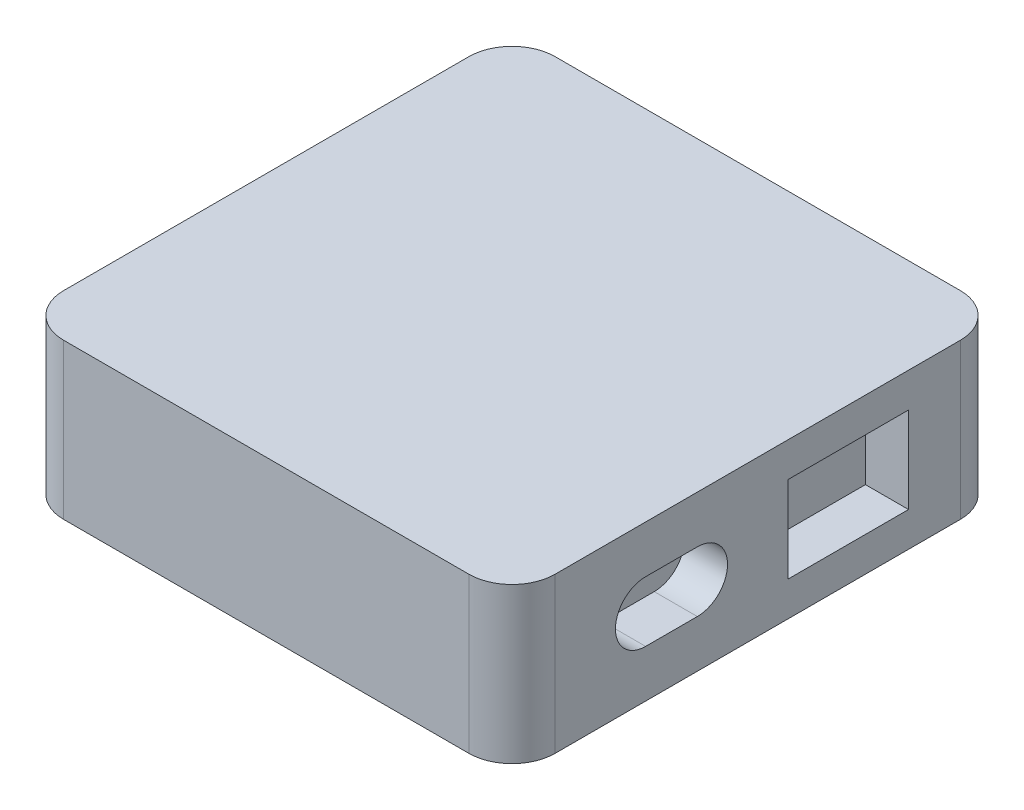
ISO-10303-21;
HEADER;
FILE_DESCRIPTION(('STEP AP214'),'2;1');
FILE_NAME('part.step','',(''),(''),'','','');
FILE_SCHEMA(('AUTOMOTIVE_DESIGN { 1 0 10303 214 1 1 1 1 }'));
ENDSEC;
DATA;
#1=APPLICATION_CONTEXT('core data for automotive mechanical design processes');
#2=APPLICATION_PROTOCOL_DEFINITION('international standard','automotive_design',2000,#1);
#3=PRODUCT_CONTEXT('',#1,'mechanical');
#4=PRODUCT('Part','Part','',(#3));
#5=PRODUCT_RELATED_PRODUCT_CATEGORY('part','',(#4));
#6=PRODUCT_DEFINITION_FORMATION('','',#4);
#7=PRODUCT_DEFINITION_CONTEXT('part definition',#1,'design');
#8=PRODUCT_DEFINITION('design','',#6,#7);
#9=PRODUCT_DEFINITION_SHAPE('','',#8);
#10=(LENGTH_UNIT() NAMED_UNIT(*) SI_UNIT(.MILLI.,.METRE.));
#11=(NAMED_UNIT(*) PLANE_ANGLE_UNIT() SI_UNIT($,.RADIAN.));
#12=(NAMED_UNIT(*) SI_UNIT($,.STERADIAN.) SOLID_ANGLE_UNIT());
#13=UNCERTAINTY_MEASURE_WITH_UNIT(LENGTH_MEASURE(1.E-05),#10,'distance_accuracy_value','');
#14=(GEOMETRIC_REPRESENTATION_CONTEXT(3) GLOBAL_UNCERTAINTY_ASSIGNED_CONTEXT((#13)) GLOBAL_UNIT_ASSIGNED_CONTEXT((#10,
#11,#12)) REPRESENTATION_CONTEXT('',''));
#15=CARTESIAN_POINT('',(0.,0.,0.));
#16=DIRECTION('',(0.,0.,1.));
#17=DIRECTION('',(1.,0.,0.));
#18=AXIS2_PLACEMENT_3D('',#15,#16,#17);
#19=CARTESIAN_POINT('',(-28.5,18.,28.5));
#20=DIRECTION('',(1.,0.,0.));
#21=DIRECTION('',(0.,0.,-1.));
#22=AXIS2_PLACEMENT_3D('',#19,#20,#21);
#23=PLANE('',#22);
#24=DIRECTION('',(0.,0.,1.));
#25=VECTOR('',#24,1.);
#26=CARTESIAN_POINT('',(-28.5,18.,28.5));
#27=LINE('',#26,#25);
#28=CARTESIAN_POINT('',(-28.5,18.,-23.5));
#29=VERTEX_POINT('',#28);
#30=CARTESIAN_POINT('',(-28.5,18.,23.5));
#31=VERTEX_POINT('',#30);
#32=EDGE_CURVE('E252',#29,#31,#27,.T.);
#33=ORIENTED_EDGE('',*,*,#32,.F.);
#34=DIRECTION('',(0.,-1.,0.));
#35=VECTOR('',#34,1.);
#36=CARTESIAN_POINT('',(-28.5,18.,-23.5));
#37=LINE('',#36,#35);
#38=CARTESIAN_POINT('',(-28.5,0.,-23.5));
#39=VERTEX_POINT('',#38);
#40=EDGE_CURVE('E289',#29,#39,#37,.T.);
#41=ORIENTED_EDGE('',*,*,#40,.T.);
#42=DIRECTION('',(0.,0.,1.));
#43=VECTOR('',#42,1.);
#44=CARTESIAN_POINT('',(-28.5,0.,28.5));
#45=LINE('',#44,#43);
#46=CARTESIAN_POINT('',(-28.5,0.,23.5));
#47=VERTEX_POINT('',#46);
#48=EDGE_CURVE('E204',#39,#47,#45,.T.);
#49=ORIENTED_EDGE('',*,*,#48,.T.);
#50=DIRECTION('',(0.,-1.,0.));
#51=VECTOR('',#50,1.);
#52=CARTESIAN_POINT('',(-28.5,18.,23.5));
#53=LINE('',#52,#51);
#54=EDGE_CURVE('E267',#47,#31,#53,.F.);
#55=ORIENTED_EDGE('',*,*,#54,.T.);
#56=EDGE_LOOP('',(#33,#41,#49,#55));
#57=FACE_BOUND('',#56,.T.);
#58=ADVANCED_FACE('F44',(#57),#23,.F.);
#59=CARTESIAN_POINT('',(28.5,18.,28.5));
#60=DIRECTION('',(0.,0.,-1.));
#61=DIRECTION('',(-1.,0.,0.));
#62=AXIS2_PLACEMENT_3D('',#59,#60,#61);
#63=PLANE('',#62);
#64=DIRECTION('',(1.,0.,0.));
#65=VECTOR('',#64,1.);
#66=CARTESIAN_POINT('',(28.5,18.,28.5));
#67=LINE('',#66,#65);
#68=CARTESIAN_POINT('',(-23.5,18.,28.5));
#69=VERTEX_POINT('',#68);
#70=CARTESIAN_POINT('',(23.5,18.,28.5));
#71=VERTEX_POINT('',#70);
#72=EDGE_CURVE('E258',#69,#71,#67,.T.);
#73=ORIENTED_EDGE('',*,*,#72,.F.);
#74=DIRECTION('',(0.,-1.,0.));
#75=VECTOR('',#74,1.);
#76=CARTESIAN_POINT('',(-23.5,18.,28.5));
#77=LINE('',#76,#75);
#78=CARTESIAN_POINT('',(-23.5,0.,28.5));
#79=VERTEX_POINT('',#78);
#80=EDGE_CURVE('E11',#69,#79,#77,.T.);
#81=ORIENTED_EDGE('',*,*,#80,.T.);
#82=DIRECTION('',(1.,0.,0.));
#83=VECTOR('',#82,1.);
#84=CARTESIAN_POINT('',(28.5,0.,28.5));
#85=LINE('',#84,#83);
#86=CARTESIAN_POINT('',(23.5,0.,28.5));
#87=VERTEX_POINT('',#86);
#88=EDGE_CURVE('E272',#79,#87,#85,.T.);
#89=ORIENTED_EDGE('',*,*,#88,.T.);
#90=DIRECTION('',(0.,-1.,0.));
#91=VECTOR('',#90,1.);
#92=CARTESIAN_POINT('',(23.5,18.,28.5));
#93=LINE('',#92,#91);
#94=EDGE_CURVE('E53',#87,#71,#93,.F.);
#95=ORIENTED_EDGE('',*,*,#94,.T.);
#96=EDGE_LOOP('',(#73,#81,#89,#95));
#97=FACE_BOUND('',#96,.T.);
#98=ADVANCED_FACE('F332',(#97),#63,.F.);
#99=CARTESIAN_POINT('',(28.5,18.,28.5));
#100=DIRECTION('',(-1.,0.,0.));
#101=DIRECTION('',(0.,0.,1.));
#102=AXIS2_PLACEMENT_3D('',#99,#100,#101);
#103=PLANE('',#102);
#104=DIRECTION('',(0.,0.,-1.));
#105=VECTOR('',#104,1.);
#106=CARTESIAN_POINT('',(28.5,5.5,13.));
#107=LINE('',#106,#105);
#108=CARTESIAN_POINT('',(28.5,5.5,13.));
#109=VERTEX_POINT('',#108);
#110=CARTESIAN_POINT('',(28.5,5.5,7.00000000000001));
#111=VERTEX_POINT('',#110);
#112=EDGE_CURVE('E192',#109,#111,#107,.T.);
#113=ORIENTED_EDGE('',*,*,#112,.F.);
#114=CARTESIAN_POINT('',(28.5,9.,13.));
#115=DIRECTION('',(1.,0.,0.));
#116=DIRECTION('',(0.,0.,-1.));
#117=AXIS2_PLACEMENT_3D('',#114,#115,#116);
#118=CIRCLE('',#117,3.5);
#119=CARTESIAN_POINT('',(28.5,12.5,13.));
#120=VERTEX_POINT('',#119);
#121=EDGE_CURVE('E63',#120,#109,#118,.T.);
#122=ORIENTED_EDGE('',*,*,#121,.F.);
#123=DIRECTION('',(0.,0.,1.));
#124=VECTOR('',#123,1.);
#125=CARTESIAN_POINT('',(28.5,12.5,13.));
#126=LINE('',#125,#124);
#127=CARTESIAN_POINT('',(28.5,12.5,7.00000000000001));
#128=VERTEX_POINT('',#127);
#129=EDGE_CURVE('E185',#128,#120,#126,.T.);
#130=ORIENTED_EDGE('',*,*,#129,.F.);
#131=CARTESIAN_POINT('',(28.5,9.,7.00000000000001));
#132=DIRECTION('',(1.,0.,0.));
#133=DIRECTION('',(0.,0.,-1.));
#134=AXIS2_PLACEMENT_3D('',#131,#132,#133);
#135=CIRCLE('',#134,3.5);
#136=EDGE_CURVE('E188',#111,#128,#135,.T.);
#137=ORIENTED_EDGE('',*,*,#136,.F.);
#138=EDGE_LOOP('',(#113,#122,#130,#137));
#139=FACE_BOUND('',#138,.T.);
#140=DIRECTION('',(0.,0.,-1.));
#141=VECTOR('',#140,1.);
#142=CARTESIAN_POINT('',(28.5,4.,-3.5));
#143=LINE('',#142,#141);
#144=CARTESIAN_POINT('',(28.5,4.,-3.5));
#145=VERTEX_POINT('',#144);
#146=CARTESIAN_POINT('',(28.5,4.,-17.5));
#147=VERTEX_POINT('',#146);
#148=EDGE_CURVE('E231',#145,#147,#143,.T.);
#149=ORIENTED_EDGE('',*,*,#148,.F.);
#150=DIRECTION('',(0.,-1.,0.));
#151=VECTOR('',#150,1.);
#152=CARTESIAN_POINT('',(28.5,14.,-3.5));
#153=LINE('',#152,#151);
#154=CARTESIAN_POINT('',(28.5,14.,-3.5));
#155=VERTEX_POINT('',#154);
#156=EDGE_CURVE('E68',#155,#145,#153,.T.);
#157=ORIENTED_EDGE('',*,*,#156,.F.);
#158=DIRECTION('',(0.,0.,1.));
#159=VECTOR('',#158,1.);
#160=CARTESIAN_POINT('',(28.5,14.,-3.5));
#161=LINE('',#160,#159);
#162=CARTESIAN_POINT('',(28.5,14.,-17.5));
#163=VERTEX_POINT('',#162);
#164=EDGE_CURVE('E224',#163,#155,#161,.T.);
#165=ORIENTED_EDGE('',*,*,#164,.F.);
#166=DIRECTION('',(0.,1.,0.));
#167=VECTOR('',#166,1.);
#168=CARTESIAN_POINT('',(28.5,14.,-17.5));
#169=LINE('',#168,#167);
#170=EDGE_CURVE('E229',#147,#163,#169,.T.);
#171=ORIENTED_EDGE('',*,*,#170,.F.);
#172=EDGE_LOOP('',(#149,#157,#165,#171));
#173=FACE_BOUND('',#172,.T.);
#174=DIRECTION('',(0.,0.,-1.));
#175=VECTOR('',#174,1.);
#176=CARTESIAN_POINT('',(28.5,0.,28.5));
#177=LINE('',#176,#175);
#178=CARTESIAN_POINT('',(28.5,0.,23.5));
#179=VERTEX_POINT('',#178);
#180=CARTESIAN_POINT('',(28.5,0.,-23.5));
#181=VERTEX_POINT('',#180);
#182=EDGE_CURVE('E280',#179,#181,#177,.T.);
#183=ORIENTED_EDGE('',*,*,#182,.T.);
#184=DIRECTION('',(0.,-1.,0.));
#185=VECTOR('',#184,1.);
#186=CARTESIAN_POINT('',(28.5,18.,-23.5));
#187=LINE('',#186,#185);
#188=CARTESIAN_POINT('',(28.5,18.,-23.5));
#189=VERTEX_POINT('',#188);
#190=EDGE_CURVE('E324',#181,#189,#187,.F.);
#191=ORIENTED_EDGE('',*,*,#190,.T.);
#192=DIRECTION('',(0.,0.,-1.));
#193=VECTOR('',#192,1.);
#194=CARTESIAN_POINT('',(28.5,18.,28.5));
#195=LINE('',#194,#193);
#196=CARTESIAN_POINT('',(28.5,18.,23.5));
#197=VERTEX_POINT('',#196);
#198=EDGE_CURVE('E261',#197,#189,#195,.T.);
#199=ORIENTED_EDGE('',*,*,#198,.F.);
#200=DIRECTION('',(0.,-1.,0.));
#201=VECTOR('',#200,1.);
#202=CARTESIAN_POINT('',(28.5,18.,23.5));
#203=LINE('',#202,#201);
#204=EDGE_CURVE('E321',#197,#179,#203,.T.);
#205=ORIENTED_EDGE('',*,*,#204,.T.);
#206=EDGE_LOOP('',(#183,#191,#199,#205));
#207=FACE_BOUND('',#206,.T.);
#208=ADVANCED_FACE('F345',(#139,#173,#207),#103,.F.);
#209=CARTESIAN_POINT('',(28.5,18.,-28.5));
#210=DIRECTION('',(0.,0.,1.));
#211=DIRECTION('',(1.,0.,0.));
#212=AXIS2_PLACEMENT_3D('',#209,#210,#211);
#213=PLANE('',#212);
#214=DIRECTION('',(-1.,0.,0.));
#215=VECTOR('',#214,1.);
#216=CARTESIAN_POINT('',(28.5,0.,-28.5));
#217=LINE('',#216,#215);
#218=CARTESIAN_POINT('',(23.5,0.,-28.5));
#219=VERTEX_POINT('',#218);
#220=CARTESIAN_POINT('',(-23.5,0.,-28.5));
#221=VERTEX_POINT('',#220);
#222=EDGE_CURVE('E260',#219,#221,#217,.T.);
#223=ORIENTED_EDGE('',*,*,#222,.T.);
#224=DIRECTION('',(0.,-1.,0.));
#225=VECTOR('',#224,1.);
#226=CARTESIAN_POINT('',(-23.5,18.,-28.5));
#227=LINE('',#226,#225);
#228=CARTESIAN_POINT('',(-23.5,18.,-28.5));
#229=VERTEX_POINT('',#228);
#230=EDGE_CURVE('E308',#221,#229,#227,.F.);
#231=ORIENTED_EDGE('',*,*,#230,.T.);
#232=DIRECTION('',(-1.,0.,0.));
#233=VECTOR('',#232,1.);
#234=CARTESIAN_POINT('',(28.5,18.,-28.5));
#235=LINE('',#234,#233);
#236=CARTESIAN_POINT('',(23.5,18.,-28.5));
#237=VERTEX_POINT('',#236);
#238=EDGE_CURVE('E264',#237,#229,#235,.T.);
#239=ORIENTED_EDGE('',*,*,#238,.F.);
#240=DIRECTION('',(0.,-1.,0.));
#241=VECTOR('',#240,1.);
#242=CARTESIAN_POINT('',(23.5,18.,-28.5));
#243=LINE('',#242,#241);
#244=EDGE_CURVE('E301',#237,#219,#243,.T.);
#245=ORIENTED_EDGE('',*,*,#244,.T.);
#246=EDGE_LOOP('',(#223,#231,#239,#245));
#247=FACE_BOUND('',#246,.T.);
#248=ADVANCED_FACE('F351',(#247),#213,.F.);
#249=CARTESIAN_POINT('',(0.,18.,0.));
#250=DIRECTION('',(0.,1.,0.));
#251=DIRECTION('',(0.,0.,1.));
#252=AXIS2_PLACEMENT_3D('',#249,#250,#251);
#253=PLANE('',#252);
#254=ORIENTED_EDGE('',*,*,#238,.T.);
#255=CARTESIAN_POINT('',(-23.5,18.,-23.5));
#256=DIRECTION('',(0.,1.,0.));
#257=DIRECTION('',(0.,0.,1.));
#258=AXIS2_PLACEMENT_3D('',#255,#256,#257);
#259=CIRCLE('',#258,5.);
#260=EDGE_CURVE('E318',#229,#29,#259,.T.);
#261=ORIENTED_EDGE('',*,*,#260,.T.);
#262=ORIENTED_EDGE('',*,*,#32,.T.);
#263=CARTESIAN_POINT('',(-23.5,18.,23.5));
#264=DIRECTION('',(0.,1.,0.));
#265=DIRECTION('',(0.,0.,1.));
#266=AXIS2_PLACEMENT_3D('',#263,#264,#265);
#267=CIRCLE('',#266,5.);
#268=EDGE_CURVE('E315',#31,#69,#267,.T.);
#269=ORIENTED_EDGE('',*,*,#268,.T.);
#270=ORIENTED_EDGE('',*,*,#72,.T.);
#271=CARTESIAN_POINT('',(23.5,18.,23.5));
#272=DIRECTION('',(0.,1.,0.));
#273=DIRECTION('',(0.,0.,1.));
#274=AXIS2_PLACEMENT_3D('',#271,#272,#273);
#275=CIRCLE('',#274,5.);
#276=EDGE_CURVE('E310',#71,#197,#275,.T.);
#277=ORIENTED_EDGE('',*,*,#276,.T.);
#278=ORIENTED_EDGE('',*,*,#198,.T.);
#279=CARTESIAN_POINT('',(23.5,18.,-23.5));
#280=DIRECTION('',(0.,1.,0.));
#281=DIRECTION('',(0.,0.,1.));
#282=AXIS2_PLACEMENT_3D('',#279,#280,#281);
#283=CIRCLE('',#282,5.);
#284=EDGE_CURVE('E312',#189,#237,#283,.T.);
#285=ORIENTED_EDGE('',*,*,#284,.T.);
#286=EDGE_LOOP('',(#254,#261,#262,#269,#270,#277,#278,#285));
#287=FACE_BOUND('',#286,.T.);
#288=ADVANCED_FACE('F339',(#287),#253,.T.);
#289=CARTESIAN_POINT('',(0.,0.,0.));
#290=DIRECTION('',(0.,1.,0.));
#291=DIRECTION('',(0.,0.,1.));
#292=AXIS2_PLACEMENT_3D('',#289,#290,#291);
#293=PLANE('',#292);
#294=ORIENTED_EDGE('',*,*,#48,.F.);
#295=CARTESIAN_POINT('',(-23.5,0.,-23.5));
#296=DIRECTION('',(0.,1.,0.));
#297=DIRECTION('',(0.,0.,1.));
#298=AXIS2_PLACEMENT_3D('',#295,#296,#297);
#299=CIRCLE('',#298,5.);
#300=EDGE_CURVE('E300',#39,#221,#299,.F.);
#301=ORIENTED_EDGE('',*,*,#300,.T.);
#302=ORIENTED_EDGE('',*,*,#222,.F.);
#303=CARTESIAN_POINT('',(23.5,0.,-23.5));
#304=DIRECTION('',(0.,1.,0.));
#305=DIRECTION('',(0.,0.,1.));
#306=AXIS2_PLACEMENT_3D('',#303,#304,#305);
#307=CIRCLE('',#306,5.);
#308=EDGE_CURVE('E298',#219,#181,#307,.F.);
#309=ORIENTED_EDGE('',*,*,#308,.T.);
#310=ORIENTED_EDGE('',*,*,#182,.F.);
#311=CARTESIAN_POINT('',(23.5,0.,23.5));
#312=DIRECTION('',(0.,1.,0.));
#313=DIRECTION('',(0.,0.,1.));
#314=AXIS2_PLACEMENT_3D('',#311,#312,#313);
#315=CIRCLE('',#314,5.);
#316=EDGE_CURVE('E287',#179,#87,#315,.F.);
#317=ORIENTED_EDGE('',*,*,#316,.T.);
#318=ORIENTED_EDGE('',*,*,#88,.F.);
#319=CARTESIAN_POINT('',(-23.5,0.,23.5));
#320=DIRECTION('',(0.,1.,0.));
#321=DIRECTION('',(0.,0.,1.));
#322=AXIS2_PLACEMENT_3D('',#319,#320,#321);
#323=CIRCLE('',#322,5.);
#324=EDGE_CURVE('E291',#79,#47,#323,.F.);
#325=ORIENTED_EDGE('',*,*,#324,.T.);
#326=EDGE_LOOP('',(#294,#301,#302,#309,#310,#317,#318,#325));
#327=FACE_BOUND('',#326,.T.);
#328=ADVANCED_FACE('F350',(#327),#293,.F.);
#329=CARTESIAN_POINT('',(-23.5,18.,-23.5));
#330=DIRECTION('',(0.,-1.,0.));
#331=DIRECTION('',(0.,0.,-1.));
#332=AXIS2_PLACEMENT_3D('',#329,#330,#331);
#333=CYLINDRICAL_SURFACE('',#332,5.);
#334=ORIENTED_EDGE('',*,*,#260,.F.);
#335=ORIENTED_EDGE('',*,*,#230,.F.);
#336=ORIENTED_EDGE('',*,*,#300,.F.);
#337=ORIENTED_EDGE('',*,*,#40,.F.);
#338=EDGE_LOOP('',(#334,#335,#336,#337));
#339=FACE_BOUND('',#338,.T.);
#340=ADVANCED_FACE('F363',(#339),#333,.T.);
#341=CARTESIAN_POINT('',(23.5,18.,-23.5));
#342=DIRECTION('',(0.,-1.,0.));
#343=DIRECTION('',(0.,0.,-1.));
#344=AXIS2_PLACEMENT_3D('',#341,#342,#343);
#345=CYLINDRICAL_SURFACE('',#344,5.);
#346=ORIENTED_EDGE('',*,*,#284,.F.);
#347=ORIENTED_EDGE('',*,*,#190,.F.);
#348=ORIENTED_EDGE('',*,*,#308,.F.);
#349=ORIENTED_EDGE('',*,*,#244,.F.);
#350=EDGE_LOOP('',(#346,#347,#348,#349));
#351=FACE_BOUND('',#350,.T.);
#352=ADVANCED_FACE('F354',(#351),#345,.T.);
#353=CARTESIAN_POINT('',(-23.5,18.,23.5));
#354=DIRECTION('',(0.,-1.,0.));
#355=DIRECTION('',(0.,0.,-1.));
#356=AXIS2_PLACEMENT_3D('',#353,#354,#355);
#357=CYLINDRICAL_SURFACE('',#356,5.);
#358=ORIENTED_EDGE('',*,*,#268,.F.);
#359=ORIENTED_EDGE('',*,*,#54,.F.);
#360=ORIENTED_EDGE('',*,*,#324,.F.);
#361=ORIENTED_EDGE('',*,*,#80,.F.);
#362=EDGE_LOOP('',(#358,#359,#360,#361));
#363=FACE_BOUND('',#362,.T.);
#364=ADVANCED_FACE('F364',(#363),#357,.T.);
#365=CARTESIAN_POINT('',(23.5,18.,23.5));
#366=DIRECTION('',(0.,-1.,0.));
#367=DIRECTION('',(0.,0.,-1.));
#368=AXIS2_PLACEMENT_3D('',#365,#366,#367);
#369=CYLINDRICAL_SURFACE('',#368,5.);
#370=ORIENTED_EDGE('',*,*,#276,.F.);
#371=ORIENTED_EDGE('',*,*,#94,.F.);
#372=ORIENTED_EDGE('',*,*,#316,.F.);
#373=ORIENTED_EDGE('',*,*,#204,.F.);
#374=EDGE_LOOP('',(#370,#371,#372,#373));
#375=FACE_BOUND('',#374,.T.);
#376=ADVANCED_FACE('F50',(#375),#369,.T.);
#377=CARTESIAN_POINT('',(23.5,14.,-3.5));
#378=DIRECTION('',(0.,0.,1.));
#379=DIRECTION('',(1.,0.,0.));
#380=AXIS2_PLACEMENT_3D('',#377,#378,#379);
#381=PLANE('',#380);
#382=ORIENTED_EDGE('',*,*,#156,.T.);
#383=DIRECTION('',(1.,0.,0.));
#384=VECTOR('',#383,1.);
#385=CARTESIAN_POINT('',(23.5,4.,-3.5));
#386=LINE('',#385,#384);
#387=CARTESIAN_POINT('',(23.5,4.,-3.5));
#388=VERTEX_POINT('',#387);
#389=EDGE_CURVE('E209',#388,#145,#386,.T.);
#390=ORIENTED_EDGE('',*,*,#389,.F.);
#391=DIRECTION('',(0.,-1.,0.));
#392=VECTOR('',#391,1.);
#393=CARTESIAN_POINT('',(23.5,14.,-3.5));
#394=LINE('',#393,#392);
#395=CARTESIAN_POINT('',(23.5,14.,-3.5));
#396=VERTEX_POINT('',#395);
#397=EDGE_CURVE('E227',#396,#388,#394,.T.);
#398=ORIENTED_EDGE('',*,*,#397,.F.);
#399=DIRECTION('',(1.,0.,0.));
#400=VECTOR('',#399,1.);
#401=CARTESIAN_POINT('',(23.5,14.,-3.5));
#402=LINE('',#401,#400);
#403=EDGE_CURVE('E219',#396,#155,#402,.T.);
#404=ORIENTED_EDGE('',*,*,#403,.T.);
#405=EDGE_LOOP('',(#382,#390,#398,#404));
#406=FACE_BOUND('',#405,.T.);
#407=ADVANCED_FACE('F371',(#406),#381,.F.);
#408=CARTESIAN_POINT('',(23.5,14.,-3.5));
#409=DIRECTION('',(0.,1.,0.));
#410=DIRECTION('',(0.,0.,1.));
#411=AXIS2_PLACEMENT_3D('',#408,#409,#410);
#412=PLANE('',#411);
#413=ORIENTED_EDGE('',*,*,#164,.T.);
#414=ORIENTED_EDGE('',*,*,#403,.F.);
#415=DIRECTION('',(0.,0.,1.));
#416=VECTOR('',#415,1.);
#417=CARTESIAN_POINT('',(23.5,14.,-3.5));
#418=LINE('',#417,#416);
#419=CARTESIAN_POINT('',(23.5,14.,-17.5));
#420=VERTEX_POINT('',#419);
#421=EDGE_CURVE('E213',#420,#396,#418,.T.);
#422=ORIENTED_EDGE('',*,*,#421,.F.);
#423=DIRECTION('',(1.,0.,0.));
#424=VECTOR('',#423,1.);
#425=CARTESIAN_POINT('',(23.5,14.,-17.5));
#426=LINE('',#425,#424);
#427=EDGE_CURVE('E220',#420,#163,#426,.T.);
#428=ORIENTED_EDGE('',*,*,#427,.T.);
#429=EDGE_LOOP('',(#413,#414,#422,#428));
#430=FACE_BOUND('',#429,.T.);
#431=ADVANCED_FACE('F411',(#430),#412,.F.);
#432=CARTESIAN_POINT('',(23.5,14.,-17.5));
#433=DIRECTION('',(0.,0.,-1.));
#434=DIRECTION('',(-1.,0.,0.));
#435=AXIS2_PLACEMENT_3D('',#432,#433,#434);
#436=PLANE('',#435);
#437=ORIENTED_EDGE('',*,*,#170,.T.);
#438=ORIENTED_EDGE('',*,*,#427,.F.);
#439=DIRECTION('',(0.,1.,0.));
#440=VECTOR('',#439,1.);
#441=CARTESIAN_POINT('',(23.5,14.,-17.5));
#442=LINE('',#441,#440);
#443=CARTESIAN_POINT('',(23.5,4.,-17.5));
#444=VERTEX_POINT('',#443);
#445=EDGE_CURVE('E243',#444,#420,#442,.T.);
#446=ORIENTED_EDGE('',*,*,#445,.F.);
#447=DIRECTION('',(1.,0.,0.));
#448=VECTOR('',#447,1.);
#449=CARTESIAN_POINT('',(23.5,4.,-17.5));
#450=LINE('',#449,#448);
#451=EDGE_CURVE('E212',#444,#147,#450,.T.);
#452=ORIENTED_EDGE('',*,*,#451,.T.);
#453=EDGE_LOOP('',(#437,#438,#446,#452));
#454=FACE_BOUND('',#453,.T.);
#455=ADVANCED_FACE('F413',(#454),#436,.F.);
#456=CARTESIAN_POINT('',(23.5,4.,-3.5));
#457=DIRECTION('',(0.,-1.,0.));
#458=DIRECTION('',(0.,0.,-1.));
#459=AXIS2_PLACEMENT_3D('',#456,#457,#458);
#460=PLANE('',#459);
#461=ORIENTED_EDGE('',*,*,#148,.T.);
#462=ORIENTED_EDGE('',*,*,#451,.F.);
#463=DIRECTION('',(0.,0.,-1.));
#464=VECTOR('',#463,1.);
#465=CARTESIAN_POINT('',(23.5,4.,-3.5));
#466=LINE('',#465,#464);
#467=EDGE_CURVE('E241',#388,#444,#466,.T.);
#468=ORIENTED_EDGE('',*,*,#467,.F.);
#469=ORIENTED_EDGE('',*,*,#389,.T.);
#470=EDGE_LOOP('',(#461,#462,#468,#469));
#471=FACE_BOUND('',#470,.T.);
#472=ADVANCED_FACE('F404',(#471),#460,.F.);
#473=CARTESIAN_POINT('',(23.5,0.,0.));
#474=DIRECTION('',(1.,0.,0.));
#475=DIRECTION('',(0.,0.,-1.));
#476=AXIS2_PLACEMENT_3D('',#473,#474,#475);
#477=PLANE('',#476);
#478=ORIENTED_EDGE('',*,*,#397,.T.);
#479=ORIENTED_EDGE('',*,*,#467,.T.);
#480=ORIENTED_EDGE('',*,*,#445,.T.);
#481=ORIENTED_EDGE('',*,*,#421,.T.);
#482=EDGE_LOOP('',(#478,#479,#480,#481));
#483=FACE_BOUND('',#482,.T.);
#484=ADVANCED_FACE('F406',(#483),#477,.T.);
#485=CARTESIAN_POINT('',(23.5,9.,13.));
#486=DIRECTION('',(1.,0.,0.));
#487=DIRECTION('',(0.,0.,-1.));
#488=AXIS2_PLACEMENT_3D('',#485,#486,#487);
#489=CYLINDRICAL_SURFACE('',#488,3.5);
#490=ORIENTED_EDGE('',*,*,#121,.T.);
#491=DIRECTION('',(1.,0.,0.));
#492=VECTOR('',#491,1.);
#493=CARTESIAN_POINT('',(23.5,5.5,13.));
#494=LINE('',#493,#492);
#495=CARTESIAN_POINT('',(23.5,5.5,13.));
#496=VERTEX_POINT('',#495);
#497=EDGE_CURVE('E160',#496,#109,#494,.T.);
#498=ORIENTED_EDGE('',*,*,#497,.F.);
#499=CARTESIAN_POINT('',(23.5,9.,13.));
#500=DIRECTION('',(1.,0.,0.));
#501=DIRECTION('',(0.,0.,-1.));
#502=AXIS2_PLACEMENT_3D('',#499,#500,#501);
#503=CIRCLE('',#502,3.5);
#504=CARTESIAN_POINT('',(23.5,12.5,13.));
#505=VERTEX_POINT('',#504);
#506=EDGE_CURVE('E161',#505,#496,#503,.T.);
#507=ORIENTED_EDGE('',*,*,#506,.F.);
#508=DIRECTION('',(1.,0.,0.));
#509=VECTOR('',#508,1.);
#510=CARTESIAN_POINT('',(23.5,12.5,13.));
#511=LINE('',#510,#509);
#512=EDGE_CURVE('E203',#505,#120,#511,.T.);
#513=ORIENTED_EDGE('',*,*,#512,.T.);
#514=EDGE_LOOP('',(#490,#498,#507,#513));
#515=FACE_BOUND('',#514,.T.);
#516=ADVANCED_FACE('F157',(#515),#489,.F.);
#517=CARTESIAN_POINT('',(23.5,12.5,13.));
#518=DIRECTION('',(0.,1.,0.));
#519=DIRECTION('',(0.,0.,1.));
#520=AXIS2_PLACEMENT_3D('',#517,#518,#519);
#521=PLANE('',#520);
#522=ORIENTED_EDGE('',*,*,#129,.T.);
#523=ORIENTED_EDGE('',*,*,#512,.F.);
#524=DIRECTION('',(0.,0.,1.));
#525=VECTOR('',#524,1.);
#526=CARTESIAN_POINT('',(23.5,12.5,13.));
#527=LINE('',#526,#525);
#528=CARTESIAN_POINT('',(23.5,12.5,7.00000000000001));
#529=VERTEX_POINT('',#528);
#530=EDGE_CURVE('E169',#529,#505,#527,.T.);
#531=ORIENTED_EDGE('',*,*,#530,.F.);
#532=DIRECTION('',(1.,0.,0.));
#533=VECTOR('',#532,1.);
#534=CARTESIAN_POINT('',(23.5,12.5,7.00000000000001));
#535=LINE('',#534,#533);
#536=EDGE_CURVE('E202',#529,#128,#535,.T.);
#537=ORIENTED_EDGE('',*,*,#536,.T.);
#538=EDGE_LOOP('',(#522,#523,#531,#537));
#539=FACE_BOUND('',#538,.T.);
#540=ADVANCED_FACE('F428',(#539),#521,.F.);
#541=CARTESIAN_POINT('',(23.5,9.,7.00000000000001));
#542=DIRECTION('',(1.,0.,0.));
#543=DIRECTION('',(0.,0.,-1.));
#544=AXIS2_PLACEMENT_3D('',#541,#542,#543);
#545=CYLINDRICAL_SURFACE('',#544,3.5);
#546=ORIENTED_EDGE('',*,*,#136,.T.);
#547=ORIENTED_EDGE('',*,*,#536,.F.);
#548=CARTESIAN_POINT('',(23.5,9.,7.00000000000001));
#549=DIRECTION('',(1.,0.,0.));
#550=DIRECTION('',(0.,0.,-1.));
#551=AXIS2_PLACEMENT_3D('',#548,#549,#550);
#552=CIRCLE('',#551,3.5);
#553=CARTESIAN_POINT('',(23.5,5.5,7.00000000000001));
#554=VERTEX_POINT('',#553);
#555=EDGE_CURVE('E176',#554,#529,#552,.T.);
#556=ORIENTED_EDGE('',*,*,#555,.F.);
#557=DIRECTION('',(1.,0.,0.));
#558=VECTOR('',#557,1.);
#559=CARTESIAN_POINT('',(23.5,5.5,7.00000000000001));
#560=LINE('',#559,#558);
#561=EDGE_CURVE('E170',#554,#111,#560,.T.);
#562=ORIENTED_EDGE('',*,*,#561,.T.);
#563=EDGE_LOOP('',(#546,#547,#556,#562));
#564=FACE_BOUND('',#563,.T.);
#565=ADVANCED_FACE('F433',(#564),#545,.F.);
#566=CARTESIAN_POINT('',(23.5,5.5,13.));
#567=DIRECTION('',(0.,-1.,0.));
#568=DIRECTION('',(0.,0.,-1.));
#569=AXIS2_PLACEMENT_3D('',#566,#567,#568);
#570=PLANE('',#569);
#571=ORIENTED_EDGE('',*,*,#112,.T.);
#572=ORIENTED_EDGE('',*,*,#561,.F.);
#573=DIRECTION('',(0.,0.,-1.));
#574=VECTOR('',#573,1.);
#575=CARTESIAN_POINT('',(23.5,5.5,13.));
#576=LINE('',#575,#574);
#577=EDGE_CURVE('E173',#496,#554,#576,.T.);
#578=ORIENTED_EDGE('',*,*,#577,.F.);
#579=ORIENTED_EDGE('',*,*,#497,.T.);
#580=EDGE_LOOP('',(#571,#572,#578,#579));
#581=FACE_BOUND('',#580,.T.);
#582=ADVANCED_FACE('F174',(#581),#570,.F.);
#583=CARTESIAN_POINT('',(23.5,9.,13.));
#584=DIRECTION('',(1.,0.,0.));
#585=DIRECTION('',(0.,0.,-1.));
#586=AXIS2_PLACEMENT_3D('',#583,#584,#585);
#587=PLANE('',#586);
#588=ORIENTED_EDGE('',*,*,#506,.T.);
#589=ORIENTED_EDGE('',*,*,#577,.T.);
#590=ORIENTED_EDGE('',*,*,#555,.T.);
#591=ORIENTED_EDGE('',*,*,#530,.T.);
#592=EDGE_LOOP('',(#588,#589,#590,#591));
#593=FACE_BOUND('',#592,.T.);
#594=ADVANCED_FACE('F178',(#593),#587,.T.);
#595=CLOSED_SHELL('',(#58,#98,#208,#248,#288,#328,#340,#352,#364,#376,#407,#431,#455,#472,#484,
#516,#540,#565,#582,#594));
#596=MANIFOLD_SOLID_BREP('B2',#595);
#597=ADVANCED_BREP_SHAPE_REPRESENTATION('',(#18,#596),#14);
#598=SHAPE_DEFINITION_REPRESENTATION(#9,#597);
ENDSEC;
END-ISO-10303-21;
